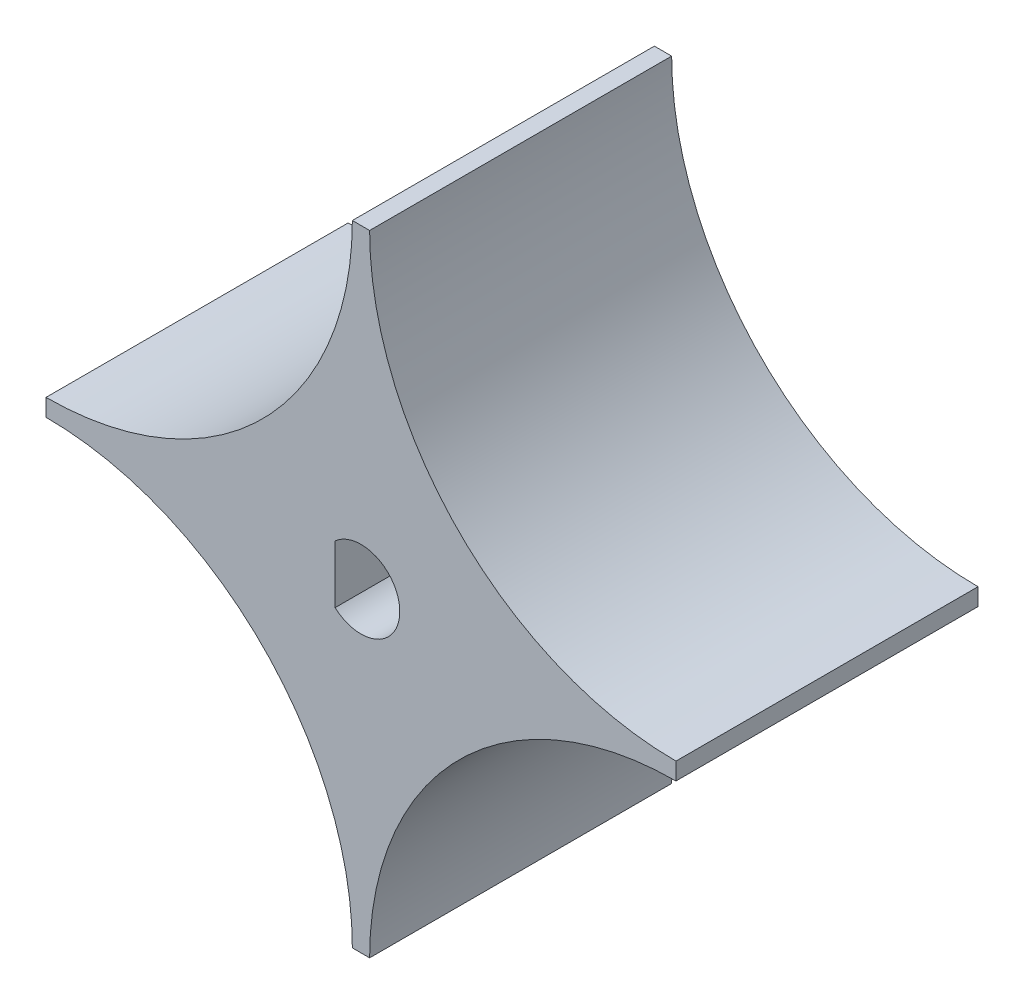
ISO-10303-21;
HEADER;
FILE_DESCRIPTION(('STEP AP214'),'2;1');
FILE_NAME('part.step','',(''),(''),'','','');
FILE_SCHEMA(('AUTOMOTIVE_DESIGN { 1 0 10303 214 1 1 1 1 }'));
ENDSEC;
DATA;
#1=APPLICATION_CONTEXT('core data for automotive mechanical design processes');
#2=APPLICATION_PROTOCOL_DEFINITION('international standard','automotive_design',2000,#1);
#3=PRODUCT_CONTEXT('',#1,'mechanical');
#4=PRODUCT('Part','Part','',(#3));
#5=PRODUCT_RELATED_PRODUCT_CATEGORY('part','',(#4));
#6=PRODUCT_DEFINITION_FORMATION('','',#4);
#7=PRODUCT_DEFINITION_CONTEXT('part definition',#1,'design');
#8=PRODUCT_DEFINITION('design','',#6,#7);
#9=PRODUCT_DEFINITION_SHAPE('','',#8);
#10=(LENGTH_UNIT() NAMED_UNIT(*) SI_UNIT(.MILLI.,.METRE.));
#11=(NAMED_UNIT(*) PLANE_ANGLE_UNIT() SI_UNIT($,.RADIAN.));
#12=(NAMED_UNIT(*) SI_UNIT($,.STERADIAN.) SOLID_ANGLE_UNIT());
#13=UNCERTAINTY_MEASURE_WITH_UNIT(LENGTH_MEASURE(1.E-05),#10,'distance_accuracy_value','');
#14=(GEOMETRIC_REPRESENTATION_CONTEXT(3) GLOBAL_UNCERTAINTY_ASSIGNED_CONTEXT((#13)) GLOBAL_UNIT_ASSIGNED_CONTEXT((#10,
#11,#12)) REPRESENTATION_CONTEXT('',''));
#15=CARTESIAN_POINT('',(0.,0.,0.));
#16=DIRECTION('',(0.,0.,1.));
#17=DIRECTION('',(1.,0.,0.));
#18=AXIS2_PLACEMENT_3D('',#15,#16,#17);
#19=CARTESIAN_POINT('',(-23.8867105036406,20.7769926773726,33.));
#20=DIRECTION('',(0.,0.,-1.));
#21=DIRECTION('',(-1.,0.,0.));
#22=AXIS2_PLACEMENT_3D('',#19,#20,#21);
#23=CYLINDRICAL_SURFACE('',#22,35.5);
#24=DIRECTION('',(0.,0.,-1.));
#25=VECTOR('',#24,1.);
#26=CARTESIAN_POINT('',(11.6132894963594,20.7769926773726,33.));
#27=LINE('',#26,#25);
#28=CARTESIAN_POINT('',(11.6132894963594,20.7769926773726,33.));
#29=VERTEX_POINT('',#28);
#30=CARTESIAN_POINT('',(11.6132894963594,20.7769926773726,-2.));
#31=VERTEX_POINT('',#30);
#32=EDGE_CURVE('E198',#29,#31,#27,.T.);
#33=ORIENTED_EDGE('',*,*,#32,.T.);
#34=CARTESIAN_POINT('',(-23.8867105036406,20.7769926773726,-2.));
#35=DIRECTION('',(0.,0.,1.));
#36=DIRECTION('',(-1.,0.,0.));
#37=AXIS2_PLACEMENT_3D('',#34,#35,#36);
#38=CIRCLE('',#37,35.5);
#39=CARTESIAN_POINT('',(-23.8867105036406,-14.7230073226274,-2.));
#40=VERTEX_POINT('',#39);
#41=EDGE_CURVE('E137',#40,#31,#38,.T.);
#42=ORIENTED_EDGE('',*,*,#41,.F.);
#43=DIRECTION('',(0.,0.,-1.));
#44=VECTOR('',#43,1.);
#45=CARTESIAN_POINT('',(-23.8867105036406,-14.7230073226274,33.));
#46=LINE('',#45,#44);
#47=CARTESIAN_POINT('',(-23.8867105036406,-14.7230073226274,33.));
#48=VERTEX_POINT('',#47);
#49=EDGE_CURVE('E11',#48,#40,#46,.T.);
#50=ORIENTED_EDGE('',*,*,#49,.F.);
#51=CARTESIAN_POINT('',(-23.8867105036406,20.7769926773726,33.));
#52=DIRECTION('',(0.,0.,-1.));
#53=DIRECTION('',(1.,0.,0.));
#54=AXIS2_PLACEMENT_3D('',#51,#52,#53);
#55=CIRCLE('',#54,35.5);
#56=EDGE_CURVE('E182',#29,#48,#55,.T.);
#57=ORIENTED_EDGE('',*,*,#56,.F.);
#58=EDGE_LOOP('',(#33,#42,#50,#57));
#59=FACE_BOUND('',#58,.T.);
#60=ADVANCED_FACE('F33',(#59),#23,.F.);
#61=CARTESIAN_POINT('',(-23.8867105036406,-14.7230073226274,33.));
#62=DIRECTION('',(1.,0.,0.));
#63=DIRECTION('',(0.,0.,-1.));
#64=AXIS2_PLACEMENT_3D('',#61,#62,#63);
#65=PLANE('',#64);
#66=ORIENTED_EDGE('',*,*,#49,.T.);
#67=DIRECTION('',(0.,1.,0.));
#68=VECTOR('',#67,1.);
#69=CARTESIAN_POINT('',(-23.8867105036406,-16.7230073226274,-2.));
#70=LINE('',#69,#68);
#71=CARTESIAN_POINT('',(-23.8867105036406,-16.7230073226274,-2.));
#72=VERTEX_POINT('',#71);
#73=EDGE_CURVE('E162',#72,#40,#70,.T.);
#74=ORIENTED_EDGE('',*,*,#73,.F.);
#75=DIRECTION('',(0.,0.,-1.));
#76=VECTOR('',#75,1.);
#77=CARTESIAN_POINT('',(-23.8867105036406,-16.7230073226274,33.));
#78=LINE('',#77,#76);
#79=CARTESIAN_POINT('',(-23.8867105036406,-16.7230073226274,33.));
#80=VERTEX_POINT('',#79);
#81=EDGE_CURVE('E40',#80,#72,#78,.T.);
#82=ORIENTED_EDGE('',*,*,#81,.F.);
#83=DIRECTION('',(0.,-1.,0.));
#84=VECTOR('',#83,1.);
#85=CARTESIAN_POINT('',(-23.8867105036406,-14.7230073226274,33.));
#86=LINE('',#85,#84);
#87=EDGE_CURVE('E185',#48,#80,#86,.T.);
#88=ORIENTED_EDGE('',*,*,#87,.F.);
#89=EDGE_LOOP('',(#66,#74,#82,#88));
#90=FACE_BOUND('',#89,.T.);
#91=ADVANCED_FACE('F220',(#90),#65,.F.);
#92=CARTESIAN_POINT('',(-23.8867105036406,-52.2230073226274,33.));
#93=DIRECTION('',(0.,0.,-1.));
#94=DIRECTION('',(-1.,0.,0.));
#95=AXIS2_PLACEMENT_3D('',#92,#93,#94);
#96=CYLINDRICAL_SURFACE('',#95,35.5);
#97=ORIENTED_EDGE('',*,*,#81,.T.);
#98=CARTESIAN_POINT('',(-23.8867105036406,-52.2230073226274,-2.));
#99=DIRECTION('',(0.,0.,1.));
#100=DIRECTION('',(-1.,0.,0.));
#101=AXIS2_PLACEMENT_3D('',#98,#99,#100);
#102=CIRCLE('',#101,35.5);
#103=CARTESIAN_POINT('',(11.6132894963594,-52.2230073226274,-2.));
#104=VERTEX_POINT('',#103);
#105=EDGE_CURVE('E159',#104,#72,#102,.T.);
#106=ORIENTED_EDGE('',*,*,#105,.F.);
#107=DIRECTION('',(0.,0.,-1.));
#108=VECTOR('',#107,1.);
#109=CARTESIAN_POINT('',(11.6132894963594,-52.2230073226274,33.));
#110=LINE('',#109,#108);
#111=CARTESIAN_POINT('',(11.6132894963594,-52.2230073226274,33.));
#112=VERTEX_POINT('',#111);
#113=EDGE_CURVE('E208',#112,#104,#110,.T.);
#114=ORIENTED_EDGE('',*,*,#113,.F.);
#115=CARTESIAN_POINT('',(-23.8867105036406,-52.2230073226274,33.));
#116=DIRECTION('',(0.,0.,-1.));
#117=DIRECTION('',(1.,0.,0.));
#118=AXIS2_PLACEMENT_3D('',#115,#116,#117);
#119=CIRCLE('',#118,35.5);
#120=EDGE_CURVE('E187',#80,#112,#119,.T.);
#121=ORIENTED_EDGE('',*,*,#120,.F.);
#122=EDGE_LOOP('',(#97,#106,#114,#121));
#123=FACE_BOUND('',#122,.T.);
#124=ADVANCED_FACE('F213',(#123),#96,.F.);
#125=CARTESIAN_POINT('',(11.6132894963594,-52.2230073226274,33.));
#126=DIRECTION('',(0.,1.,0.));
#127=DIRECTION('',(0.,0.,1.));
#128=AXIS2_PLACEMENT_3D('',#125,#126,#127);
#129=PLANE('',#128);
#130=ORIENTED_EDGE('',*,*,#113,.T.);
#131=DIRECTION('',(-1.,0.,0.));
#132=VECTOR('',#131,1.);
#133=CARTESIAN_POINT('',(13.6132894963594,-52.2230073226274,-2.));
#134=LINE('',#133,#132);
#135=CARTESIAN_POINT('',(13.6132894963594,-52.2230073226274,-2.));
#136=VERTEX_POINT('',#135);
#137=EDGE_CURVE('E156',#136,#104,#134,.T.);
#138=ORIENTED_EDGE('',*,*,#137,.F.);
#139=DIRECTION('',(0.,0.,-1.));
#140=VECTOR('',#139,1.);
#141=CARTESIAN_POINT('',(13.6132894963594,-52.2230073226274,33.));
#142=LINE('',#141,#140);
#143=CARTESIAN_POINT('',(13.6132894963594,-52.2230073226274,33.));
#144=VERTEX_POINT('',#143);
#145=EDGE_CURVE('E206',#144,#136,#142,.T.);
#146=ORIENTED_EDGE('',*,*,#145,.F.);
#147=DIRECTION('',(1.,0.,0.));
#148=VECTOR('',#147,1.);
#149=CARTESIAN_POINT('',(11.6132894963594,-52.2230073226274,33.));
#150=LINE('',#149,#148);
#151=EDGE_CURVE('E189',#112,#144,#150,.T.);
#152=ORIENTED_EDGE('',*,*,#151,.F.);
#153=EDGE_LOOP('',(#130,#138,#146,#152));
#154=FACE_BOUND('',#153,.T.);
#155=ADVANCED_FACE('F244',(#154),#129,.F.);
#156=CARTESIAN_POINT('',(49.1132894963594,-52.2230073226274,33.));
#157=DIRECTION('',(0.,0.,-1.));
#158=DIRECTION('',(-1.,0.,0.));
#159=AXIS2_PLACEMENT_3D('',#156,#157,#158);
#160=CYLINDRICAL_SURFACE('',#159,35.5);
#161=ORIENTED_EDGE('',*,*,#145,.T.);
#162=CARTESIAN_POINT('',(49.1132894963594,-52.2230073226274,-2.));
#163=DIRECTION('',(0.,0.,1.));
#164=DIRECTION('',(-1.,0.,0.));
#165=AXIS2_PLACEMENT_3D('',#162,#163,#164);
#166=CIRCLE('',#165,35.5);
#167=CARTESIAN_POINT('',(49.1132894963594,-16.7230073226274,-2.));
#168=VERTEX_POINT('',#167);
#169=EDGE_CURVE('E153',#168,#136,#166,.T.);
#170=ORIENTED_EDGE('',*,*,#169,.F.);
#171=DIRECTION('',(0.,0.,-1.));
#172=VECTOR('',#171,1.);
#173=CARTESIAN_POINT('',(49.1132894963594,-16.7230073226274,33.));
#174=LINE('',#173,#172);
#175=CARTESIAN_POINT('',(49.1132894963594,-16.7230073226274,33.));
#176=VERTEX_POINT('',#175);
#177=EDGE_CURVE('E204',#176,#168,#174,.T.);
#178=ORIENTED_EDGE('',*,*,#177,.F.);
#179=CARTESIAN_POINT('',(49.1132894963594,-52.2230073226274,33.));
#180=DIRECTION('',(0.,0.,-1.));
#181=DIRECTION('',(1.,0.,0.));
#182=AXIS2_PLACEMENT_3D('',#179,#180,#181);
#183=CIRCLE('',#182,35.5);
#184=EDGE_CURVE('E191',#144,#176,#183,.T.);
#185=ORIENTED_EDGE('',*,*,#184,.F.);
#186=EDGE_LOOP('',(#161,#170,#178,#185));
#187=FACE_BOUND('',#186,.T.);
#188=ADVANCED_FACE('F239',(#187),#160,.F.);
#189=CARTESIAN_POINT('',(49.1132894963594,-14.7230073226274,33.));
#190=DIRECTION('',(-1.,0.,0.));
#191=DIRECTION('',(0.,0.,1.));
#192=AXIS2_PLACEMENT_3D('',#189,#190,#191);
#193=PLANE('',#192);
#194=ORIENTED_EDGE('',*,*,#177,.T.);
#195=DIRECTION('',(0.,-1.,0.));
#196=VECTOR('',#195,1.);
#197=CARTESIAN_POINT('',(49.1132894963594,-14.7230073226274,-2.));
#198=LINE('',#197,#196);
#199=CARTESIAN_POINT('',(49.1132894963594,-14.7230073226274,-2.));
#200=VERTEX_POINT('',#199);
#201=EDGE_CURVE('E150',#200,#168,#198,.T.);
#202=ORIENTED_EDGE('',*,*,#201,.F.);
#203=DIRECTION('',(0.,0.,-1.));
#204=VECTOR('',#203,1.);
#205=CARTESIAN_POINT('',(49.1132894963594,-14.7230073226274,33.));
#206=LINE('',#205,#204);
#207=CARTESIAN_POINT('',(49.1132894963594,-14.7230073226274,33.));
#208=VERTEX_POINT('',#207);
#209=EDGE_CURVE('E202',#208,#200,#206,.T.);
#210=ORIENTED_EDGE('',*,*,#209,.F.);
#211=DIRECTION('',(0.,1.,0.));
#212=VECTOR('',#211,1.);
#213=CARTESIAN_POINT('',(49.1132894963594,-14.7230073226274,33.));
#214=LINE('',#213,#212);
#215=EDGE_CURVE('E193',#176,#208,#214,.T.);
#216=ORIENTED_EDGE('',*,*,#215,.F.);
#217=EDGE_LOOP('',(#194,#202,#210,#216));
#218=FACE_BOUND('',#217,.T.);
#219=ADVANCED_FACE('F235',(#218),#193,.F.);
#220=CARTESIAN_POINT('',(49.1132894963594,20.7769926773726,33.));
#221=DIRECTION('',(0.,0.,-1.));
#222=DIRECTION('',(-1.,0.,0.));
#223=AXIS2_PLACEMENT_3D('',#220,#221,#222);
#224=CYLINDRICAL_SURFACE('',#223,35.5);
#225=ORIENTED_EDGE('',*,*,#209,.T.);
#226=CARTESIAN_POINT('',(49.1132894963594,20.7769926773726,-2.));
#227=DIRECTION('',(0.,0.,1.));
#228=DIRECTION('',(-1.,0.,0.));
#229=AXIS2_PLACEMENT_3D('',#226,#227,#228);
#230=CIRCLE('',#229,35.5);
#231=CARTESIAN_POINT('',(13.6132894963594,20.7769926773726,-2.));
#232=VERTEX_POINT('',#231);
#233=EDGE_CURVE('E147',#232,#200,#230,.T.);
#234=ORIENTED_EDGE('',*,*,#233,.F.);
#235=DIRECTION('',(0.,0.,-1.));
#236=VECTOR('',#235,1.);
#237=CARTESIAN_POINT('',(13.6132894963594,20.7769926773726,33.));
#238=LINE('',#237,#236);
#239=CARTESIAN_POINT('',(13.6132894963594,20.7769926773726,33.));
#240=VERTEX_POINT('',#239);
#241=EDGE_CURVE('E200',#240,#232,#238,.T.);
#242=ORIENTED_EDGE('',*,*,#241,.F.);
#243=CARTESIAN_POINT('',(49.1132894963594,20.7769926773726,33.));
#244=DIRECTION('',(0.,0.,-1.));
#245=DIRECTION('',(1.,0.,0.));
#246=AXIS2_PLACEMENT_3D('',#243,#244,#245);
#247=CIRCLE('',#246,35.5);
#248=EDGE_CURVE('E195',#208,#240,#247,.T.);
#249=ORIENTED_EDGE('',*,*,#248,.F.);
#250=EDGE_LOOP('',(#225,#234,#242,#249));
#251=FACE_BOUND('',#250,.T.);
#252=ADVANCED_FACE('F230',(#251),#224,.F.);
#253=CARTESIAN_POINT('',(11.6132894963594,20.7769926773726,33.));
#254=DIRECTION('',(0.,-1.,0.));
#255=DIRECTION('',(1.,0.,0.));
#256=AXIS2_PLACEMENT_3D('',#253,#254,#255);
#257=PLANE('',#256);
#258=ORIENTED_EDGE('',*,*,#241,.T.);
#259=DIRECTION('',(1.,0.,0.));
#260=VECTOR('',#259,1.);
#261=CARTESIAN_POINT('',(11.6132894963594,20.7769926773726,-2.));
#262=LINE('',#261,#260);
#263=EDGE_CURVE('E144',#31,#232,#262,.T.);
#264=ORIENTED_EDGE('',*,*,#263,.F.);
#265=ORIENTED_EDGE('',*,*,#32,.F.);
#266=DIRECTION('',(-1.,0.,0.));
#267=VECTOR('',#266,1.);
#268=CARTESIAN_POINT('',(11.6132894963594,20.7769926773726,33.));
#269=LINE('',#268,#267);
#270=EDGE_CURVE('E55',#240,#29,#269,.T.);
#271=ORIENTED_EDGE('',*,*,#270,.F.);
#272=EDGE_LOOP('',(#258,#264,#265,#271));
#273=FACE_BOUND('',#272,.T.);
#274=ADVANCED_FACE('F248',(#273),#257,.F.);
#275=CARTESIAN_POINT('',(-23.8867105036406,20.7769926773726,33.));
#276=DIRECTION('',(0.,0.,1.));
#277=DIRECTION('',(1.,0.,0.));
#278=AXIS2_PLACEMENT_3D('',#275,#276,#277);
#279=PLANE('',#278);
#280=CARTESIAN_POINT('',(12.6132894963594,-15.7230073226274,33.));
#281=DIRECTION('',(0.,0.,1.));
#282=DIRECTION('',(1.,0.,0.));
#283=AXIS2_PLACEMENT_3D('',#280,#281,#282);
#284=CIRCLE('',#283,4.5);
#285=CARTESIAN_POINT('',(9.61328949635939,-19.0771092888771,33.));
#286=VERTEX_POINT('',#285);
#287=CARTESIAN_POINT('',(9.61328949635939,-12.3689053563777,33.));
#288=VERTEX_POINT('',#287);
#289=EDGE_CURVE('E47',#286,#288,#284,.T.);
#290=ORIENTED_EDGE('',*,*,#289,.F.);
#291=DIRECTION('',(0.,-1.,0.));
#292=VECTOR('',#291,1.);
#293=CARTESIAN_POINT('',(9.61328949635939,-12.3689053563777,33.));
#294=LINE('',#293,#292);
#295=EDGE_CURVE('E173',#288,#286,#294,.T.);
#296=ORIENTED_EDGE('',*,*,#295,.F.);
#297=EDGE_LOOP('',(#290,#296));
#298=FACE_BOUND('',#297,.T.);
#299=ORIENTED_EDGE('',*,*,#56,.T.);
#300=ORIENTED_EDGE('',*,*,#87,.T.);
#301=ORIENTED_EDGE('',*,*,#120,.T.);
#302=ORIENTED_EDGE('',*,*,#151,.T.);
#303=ORIENTED_EDGE('',*,*,#184,.T.);
#304=ORIENTED_EDGE('',*,*,#215,.T.);
#305=ORIENTED_EDGE('',*,*,#248,.T.);
#306=ORIENTED_EDGE('',*,*,#270,.T.);
#307=EDGE_LOOP('',(#299,#300,#301,#302,#303,#304,#305,#306));
#308=FACE_BOUND('',#307,.T.);
#309=ADVANCED_FACE('F245',(#298,#308),#279,.T.);
#310=CARTESIAN_POINT('',(12.6132894963594,-15.7230073226274,23.));
#311=DIRECTION('',(0.,0.,1.));
#312=DIRECTION('',(1.,0.,0.));
#313=AXIS2_PLACEMENT_3D('',#310,#311,#312);
#314=CYLINDRICAL_SURFACE('',#313,4.5);
#315=ORIENTED_EDGE('',*,*,#289,.T.);
#316=DIRECTION('',(0.,0.,1.));
#317=VECTOR('',#316,1.);
#318=CARTESIAN_POINT('',(9.61328949635939,-12.3689053563777,23.));
#319=LINE('',#318,#317);
#320=CARTESIAN_POINT('',(9.61328949635939,-12.3689053563777,23.));
#321=VERTEX_POINT('',#320);
#322=EDGE_CURVE('E176',#321,#288,#319,.T.);
#323=ORIENTED_EDGE('',*,*,#322,.F.);
#324=CARTESIAN_POINT('',(12.6132894963594,-15.7230073226274,23.));
#325=DIRECTION('',(0.,0.,1.));
#326=DIRECTION('',(1.,0.,0.));
#327=AXIS2_PLACEMENT_3D('',#324,#325,#326);
#328=CIRCLE('',#327,4.5);
#329=CARTESIAN_POINT('',(9.61328949635939,-19.0771092888771,23.));
#330=VERTEX_POINT('',#329);
#331=EDGE_CURVE('E169',#330,#321,#328,.T.);
#332=ORIENTED_EDGE('',*,*,#331,.F.);
#333=DIRECTION('',(0.,0.,1.));
#334=VECTOR('',#333,1.);
#335=CARTESIAN_POINT('',(9.61328949635939,-19.0771092888771,23.));
#336=LINE('',#335,#334);
#337=EDGE_CURVE('E180',#330,#286,#336,.T.);
#338=ORIENTED_EDGE('',*,*,#337,.T.);
#339=EDGE_LOOP('',(#315,#323,#332,#338));
#340=FACE_BOUND('',#339,.T.);
#341=ADVANCED_FACE('F247',(#340),#314,.F.);
#342=CARTESIAN_POINT('',(9.61328949635939,-12.3689053563777,23.));
#343=DIRECTION('',(-1.,0.,0.));
#344=DIRECTION('',(0.,0.,1.));
#345=AXIS2_PLACEMENT_3D('',#342,#343,#344);
#346=PLANE('',#345);
#347=ORIENTED_EDGE('',*,*,#295,.T.);
#348=ORIENTED_EDGE('',*,*,#337,.F.);
#349=DIRECTION('',(0.,-1.,0.));
#350=VECTOR('',#349,1.);
#351=CARTESIAN_POINT('',(9.61328949635939,-12.3689053563777,23.));
#352=LINE('',#351,#350);
#353=EDGE_CURVE('E172',#321,#330,#352,.T.);
#354=ORIENTED_EDGE('',*,*,#353,.F.);
#355=ORIENTED_EDGE('',*,*,#322,.T.);
#356=EDGE_LOOP('',(#347,#348,#354,#355));
#357=FACE_BOUND('',#356,.T.);
#358=ADVANCED_FACE('F255',(#357),#346,.F.);
#359=CARTESIAN_POINT('',(12.6132894963594,-15.7230073226274,23.));
#360=DIRECTION('',(0.,0.,1.));
#361=DIRECTION('',(1.,0.,0.));
#362=AXIS2_PLACEMENT_3D('',#359,#360,#361);
#363=PLANE('',#362);
#364=ORIENTED_EDGE('',*,*,#331,.T.);
#365=ORIENTED_EDGE('',*,*,#353,.T.);
#366=EDGE_LOOP('',(#364,#365));
#367=FACE_BOUND('',#366,.T.);
#368=ADVANCED_FACE('F293',(#367),#363,.T.);
#369=CARTESIAN_POINT('',(-23.8867105036406,20.7769926773726,-2.));
#370=DIRECTION('',(0.,0.,-1.));
#371=DIRECTION('',(-1.,0.,0.));
#372=AXIS2_PLACEMENT_3D('',#369,#370,#371);
#373=PLANE('',#372);
#374=ORIENTED_EDGE('',*,*,#41,.T.);
#375=ORIENTED_EDGE('',*,*,#263,.T.);
#376=ORIENTED_EDGE('',*,*,#233,.T.);
#377=ORIENTED_EDGE('',*,*,#201,.T.);
#378=ORIENTED_EDGE('',*,*,#169,.T.);
#379=ORIENTED_EDGE('',*,*,#137,.T.);
#380=ORIENTED_EDGE('',*,*,#105,.T.);
#381=ORIENTED_EDGE('',*,*,#73,.T.);
#382=EDGE_LOOP('',(#374,#375,#376,#377,#378,#379,#380,#381));
#383=FACE_BOUND('',#382,.T.);
#384=DIRECTION('',(0.,-1.,0.));
#385=VECTOR('',#384,1.);
#386=CARTESIAN_POINT('',(15.6132894963594,-12.3689053563777,-2.));
#387=LINE('',#386,#385);
#388=CARTESIAN_POINT('',(15.6132894963594,-12.3689053563777,-2.));
#389=VERTEX_POINT('',#388);
#390=CARTESIAN_POINT('',(15.6132894963594,-19.0771092888771,-2.));
#391=VERTEX_POINT('',#390);
#392=EDGE_CURVE('E134',#389,#391,#387,.T.);
#393=ORIENTED_EDGE('',*,*,#392,.F.);
#394=CARTESIAN_POINT('',(12.6132894963594,-15.7230073226274,-2.));
#395=DIRECTION('',(0.,0.,-1.));
#396=DIRECTION('',(-1.,0.,0.));
#397=AXIS2_PLACEMENT_3D('',#394,#395,#396);
#398=CIRCLE('',#397,4.50000000000001);
#399=EDGE_CURVE('E125',#391,#389,#398,.T.);
#400=ORIENTED_EDGE('',*,*,#399,.F.);
#401=EDGE_LOOP('',(#393,#400));
#402=FACE_BOUND('',#401,.T.);
#403=ADVANCED_FACE('F139',(#383,#402),#373,.T.);
#404=CARTESIAN_POINT('',(12.6132894963594,-15.7230073226274,10.));
#405=DIRECTION('',(0.,0.,-1.));
#406=DIRECTION('',(-1.,0.,0.));
#407=AXIS2_PLACEMENT_3D('',#404,#405,#406);
#408=PLANE('',#407);
#409=CARTESIAN_POINT('',(12.6132894963594,-15.7230073226274,10.));
#410=DIRECTION('',(0.,0.,-1.));
#411=DIRECTION('',(-1.,0.,0.));
#412=AXIS2_PLACEMENT_3D('',#409,#410,#411);
#413=CIRCLE('',#412,4.50000000000001);
#414=CARTESIAN_POINT('',(15.6132894963594,-19.0771092888771,10.));
#415=VERTEX_POINT('',#414);
#416=CARTESIAN_POINT('',(15.6132894963594,-12.3689053563777,10.));
#417=VERTEX_POINT('',#416);
#418=EDGE_CURVE('E128',#415,#417,#413,.T.);
#419=ORIENTED_EDGE('',*,*,#418,.T.);
#420=DIRECTION('',(0.,-1.,0.));
#421=VECTOR('',#420,1.);
#422=CARTESIAN_POINT('',(15.6132894963594,-12.3689053563777,10.));
#423=LINE('',#422,#421);
#424=EDGE_CURVE('E166',#417,#415,#423,.T.);
#425=ORIENTED_EDGE('',*,*,#424,.T.);
#426=EDGE_LOOP('',(#419,#425));
#427=FACE_BOUND('',#426,.T.);
#428=ADVANCED_FACE('F292',(#427),#408,.T.);
#429=CARTESIAN_POINT('',(12.6132894963594,-15.7230073226274,10.));
#430=DIRECTION('',(0.,0.,-1.));
#431=DIRECTION('',(-1.,0.,0.));
#432=AXIS2_PLACEMENT_3D('',#429,#430,#431);
#433=CYLINDRICAL_SURFACE('',#432,4.50000000000001);
#434=DIRECTION('',(0.,0.,-1.));
#435=VECTOR('',#434,1.);
#436=CARTESIAN_POINT('',(15.6132894963594,-19.0771092888771,10.));
#437=LINE('',#436,#435);
#438=EDGE_CURVE('E121',#415,#391,#437,.T.);
#439=ORIENTED_EDGE('',*,*,#438,.T.);
#440=ORIENTED_EDGE('',*,*,#399,.T.);
#441=DIRECTION('',(0.,0.,-1.));
#442=VECTOR('',#441,1.);
#443=CARTESIAN_POINT('',(15.6132894963594,-12.3689053563777,10.));
#444=LINE('',#443,#442);
#445=EDGE_CURVE('E132',#417,#389,#444,.T.);
#446=ORIENTED_EDGE('',*,*,#445,.F.);
#447=ORIENTED_EDGE('',*,*,#418,.F.);
#448=EDGE_LOOP('',(#439,#440,#446,#447));
#449=FACE_BOUND('',#448,.T.);
#450=ADVANCED_FACE('F123',(#449),#433,.F.);
#451=CARTESIAN_POINT('',(15.6132894963594,-12.3689053563777,10.));
#452=DIRECTION('',(1.,0.,0.));
#453=DIRECTION('',(0.,0.,-1.));
#454=AXIS2_PLACEMENT_3D('',#451,#452,#453);
#455=PLANE('',#454);
#456=ORIENTED_EDGE('',*,*,#445,.T.);
#457=ORIENTED_EDGE('',*,*,#392,.T.);
#458=ORIENTED_EDGE('',*,*,#438,.F.);
#459=ORIENTED_EDGE('',*,*,#424,.F.);
#460=EDGE_LOOP('',(#456,#457,#458,#459));
#461=FACE_BOUND('',#460,.T.);
#462=ADVANCED_FACE('F135',(#461),#455,.F.);
#463=CLOSED_SHELL('',(#60,#91,#124,#155,#188,#219,#252,#274,#309,#341,#358,#368,#403,#428,#450,#462));
#464=MANIFOLD_SOLID_BREP('B2',#463);
#465=ADVANCED_BREP_SHAPE_REPRESENTATION('',(#18,#464),#14);
#466=SHAPE_DEFINITION_REPRESENTATION(#9,#465);
ENDSEC;
END-ISO-10303-21;
